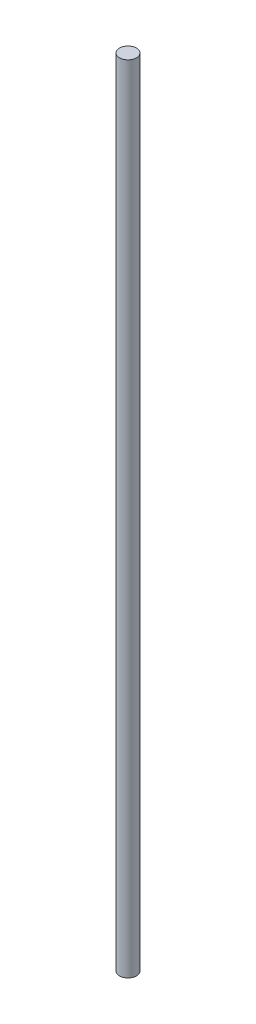
ISO-10303-21;
HEADER;
FILE_DESCRIPTION(('STEP AP214'),'2;1');
FILE_NAME('part.step','',(''),(''),'','','');
FILE_SCHEMA(('AUTOMOTIVE_DESIGN { 1 0 10303 214 1 1 1 1 }'));
ENDSEC;
DATA;
#1=APPLICATION_CONTEXT('core data for automotive mechanical design processes');
#2=APPLICATION_PROTOCOL_DEFINITION('international standard','automotive_design',2000,#1);
#3=PRODUCT_CONTEXT('',#1,'mechanical');
#4=PRODUCT('Part','Part','',(#3));
#5=PRODUCT_RELATED_PRODUCT_CATEGORY('part','',(#4));
#6=PRODUCT_DEFINITION_FORMATION('','',#4);
#7=PRODUCT_DEFINITION_CONTEXT('part definition',#1,'design');
#8=PRODUCT_DEFINITION('design','',#6,#7);
#9=PRODUCT_DEFINITION_SHAPE('','',#8);
#10=(LENGTH_UNIT() NAMED_UNIT(*) SI_UNIT(.MILLI.,.METRE.));
#11=(NAMED_UNIT(*) PLANE_ANGLE_UNIT() SI_UNIT($,.RADIAN.));
#12=(NAMED_UNIT(*) SI_UNIT($,.STERADIAN.) SOLID_ANGLE_UNIT());
#13=UNCERTAINTY_MEASURE_WITH_UNIT(LENGTH_MEASURE(1.E-05),#10,'distance_accuracy_value','');
#14=(GEOMETRIC_REPRESENTATION_CONTEXT(3) GLOBAL_UNCERTAINTY_ASSIGNED_CONTEXT((#13)) GLOBAL_UNIT_ASSIGNED_CONTEXT((#10,
#11,#12)) REPRESENTATION_CONTEXT('',''));
#15=CARTESIAN_POINT('',(0.,0.,0.));
#16=DIRECTION('',(0.,0.,1.));
#17=DIRECTION('',(1.,0.,0.));
#18=AXIS2_PLACEMENT_3D('',#15,#16,#17);
#19=CARTESIAN_POINT('',(1.66533453693773E-13,375.,1.11022302462516E-13));
#20=DIRECTION('',(0.,-1.,0.));
#21=DIRECTION('',(0.,0.,-1.));
#22=AXIS2_PLACEMENT_3D('',#19,#20,#21);
#23=CYLINDRICAL_SURFACE('',#22,4.);
#24=CARTESIAN_POINT('',(1.66533453693773E-13,375.,1.11022302462516E-13));
#25=DIRECTION('',(0.,1.,0.));
#26=DIRECTION('',(0.,0.,1.));
#27=AXIS2_PLACEMENT_3D('',#24,#25,#26);
#28=CIRCLE('',#27,4.);
#29=CARTESIAN_POINT('',(1.66533453693773E-13,375.,4.00000000000011));
#30=VERTEX_POINT('',#29);
#31=EDGE_CURVE('E10',#30,#30,#28,.T.);
#32=ORIENTED_EDGE('',*,*,#31,.F.);
#33=EDGE_LOOP('',(#32));
#34=FACE_BOUND('',#33,.T.);
#35=CARTESIAN_POINT('',(0.,0.,0.));
#36=DIRECTION('',(0.,1.,0.));
#37=DIRECTION('',(0.,0.,1.));
#38=AXIS2_PLACEMENT_3D('',#35,#36,#37);
#39=CIRCLE('',#38,4.);
#40=CARTESIAN_POINT('',(0.,0.,4.));
#41=VERTEX_POINT('',#40);
#42=EDGE_CURVE('E36',#41,#41,#39,.T.);
#43=ORIENTED_EDGE('',*,*,#42,.T.);
#44=EDGE_LOOP('',(#43));
#45=FACE_BOUND('',#44,.T.);
#46=ADVANCED_FACE('F33',(#34,#45),#23,.T.);
#47=CARTESIAN_POINT('',(1.66533453693773E-13,375.,1.11022302462516E-13));
#48=DIRECTION('',(0.,1.,0.));
#49=DIRECTION('',(0.,0.,1.));
#50=AXIS2_PLACEMENT_3D('',#47,#48,#49);
#51=PLANE('',#50);
#52=ORIENTED_EDGE('',*,*,#31,.T.);
#53=EDGE_LOOP('',(#52));
#54=FACE_BOUND('',#53,.T.);
#55=ADVANCED_FACE('F48',(#54),#51,.T.);
#56=CARTESIAN_POINT('',(0.,0.,0.));
#57=DIRECTION('',(0.,1.,0.));
#58=DIRECTION('',(0.,0.,1.));
#59=AXIS2_PLACEMENT_3D('',#56,#57,#58);
#60=PLANE('',#59);
#61=ORIENTED_EDGE('',*,*,#42,.F.);
#62=EDGE_LOOP('',(#61));
#63=FACE_BOUND('',#62,.T.);
#64=ADVANCED_FACE('F46',(#63),#60,.F.);
#65=CLOSED_SHELL('',(#46,#55,#64));
#66=MANIFOLD_SOLID_BREP('B2',#65);
#67=ADVANCED_BREP_SHAPE_REPRESENTATION('',(#18,#66),#14);
#68=SHAPE_DEFINITION_REPRESENTATION(#9,#67);
ENDSEC;
END-ISO-10303-21;
